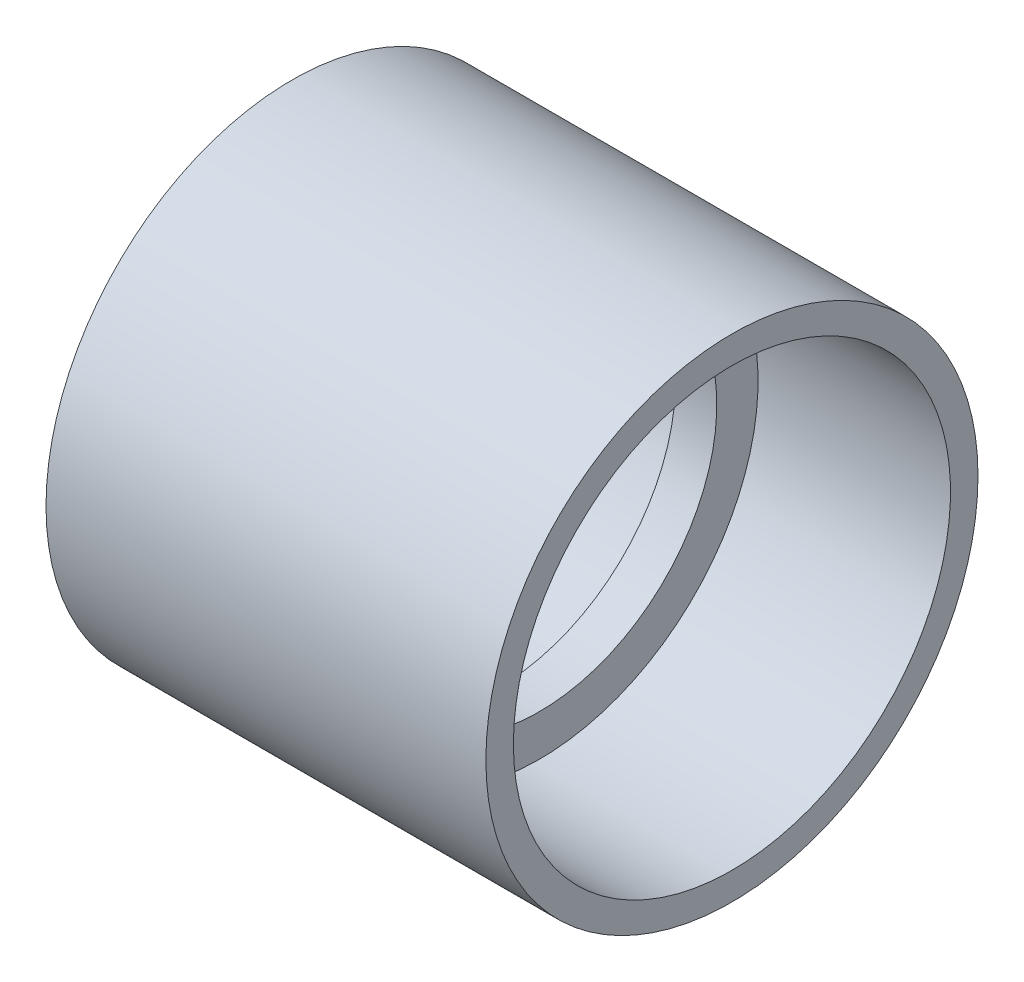
ISO-10303-21;
HEADER;
FILE_DESCRIPTION(('STEP AP214'),'2;1');
FILE_NAME('part.step','',(''),(''),'','','');
FILE_SCHEMA(('AUTOMOTIVE_DESIGN { 1 0 10303 214 1 1 1 1 }'));
ENDSEC;
DATA;
#1=APPLICATION_CONTEXT('core data for automotive mechanical design processes');
#2=APPLICATION_PROTOCOL_DEFINITION('international standard','automotive_design',2000,#1);
#3=PRODUCT_CONTEXT('',#1,'mechanical');
#4=PRODUCT('Part','Part','',(#3));
#5=PRODUCT_RELATED_PRODUCT_CATEGORY('part','',(#4));
#6=PRODUCT_DEFINITION_FORMATION('','',#4);
#7=PRODUCT_DEFINITION_CONTEXT('part definition',#1,'design');
#8=PRODUCT_DEFINITION('design','',#6,#7);
#9=PRODUCT_DEFINITION_SHAPE('','',#8);
#10=(LENGTH_UNIT() NAMED_UNIT(*) SI_UNIT(.MILLI.,.METRE.));
#11=(NAMED_UNIT(*) PLANE_ANGLE_UNIT() SI_UNIT($,.RADIAN.));
#12=(NAMED_UNIT(*) SI_UNIT($,.STERADIAN.) SOLID_ANGLE_UNIT());
#13=UNCERTAINTY_MEASURE_WITH_UNIT(LENGTH_MEASURE(1.E-05),#10,'distance_accuracy_value','');
#14=(GEOMETRIC_REPRESENTATION_CONTEXT(3) GLOBAL_UNCERTAINTY_ASSIGNED_CONTEXT((#13)) GLOBAL_UNIT_ASSIGNED_CONTEXT((#10,
#11,#12)) REPRESENTATION_CONTEXT('',''));
#15=CARTESIAN_POINT('',(0.,0.,0.));
#16=DIRECTION('',(0.,0.,1.));
#17=DIRECTION('',(1.,0.,0.));
#18=AXIS2_PLACEMENT_3D('',#15,#16,#17);
#19=CARTESIAN_POINT('',(-15.,0.,-15.9));
#20=DIRECTION('',(-1.,0.,0.));
#21=DIRECTION('',(0.,0.,0.999999999999999));
#22=AXIS2_PLACEMENT_3D('',#19,#20,#21);
#23=PLANE('',#22);
#24=CARTESIAN_POINT('',(-15.,0.,0.));
#25=DIRECTION('',(-1.,0.,0.));
#26=DIRECTION('',(0.,0.,0.999999999999999));
#27=AXIS2_PLACEMENT_3D('',#24,#25,#26);
#28=CIRCLE('',#27,17.9);
#29=CARTESIAN_POINT('',(-15.,0.,17.9));
#30=VERTEX_POINT('',#29);
#31=EDGE_CURVE('E12',#30,#30,#28,.T.);
#32=ORIENTED_EDGE('',*,*,#31,.T.);
#33=EDGE_LOOP('',(#32));
#34=FACE_BOUND('',#33,.T.);
#35=CARTESIAN_POINT('',(-15.,0.,0.));
#36=DIRECTION('',(-1.,0.,0.));
#37=DIRECTION('',(0.,0.,0.999999999999999));
#38=AXIS2_PLACEMENT_3D('',#35,#36,#37);
#39=CIRCLE('',#38,15.9);
#40=CARTESIAN_POINT('',(-15.,0.,15.9));
#41=VERTEX_POINT('',#40);
#42=EDGE_CURVE('E90',#41,#41,#39,.T.);
#43=ORIENTED_EDGE('',*,*,#42,.F.);
#44=EDGE_LOOP('',(#43));
#45=FACE_BOUND('',#44,.T.);
#46=ADVANCED_FACE('F51',(#34,#45),#23,.T.);
#47=CARTESIAN_POINT('',(-15.,0.,0.));
#48=DIRECTION('',(-1.,0.,0.));
#49=DIRECTION('',(0.,0.,0.999999999999999));
#50=AXIS2_PLACEMENT_3D('',#47,#48,#49);
#51=CYLINDRICAL_SURFACE('',#50,17.9);
#52=CARTESIAN_POINT('',(17.,0.,0.));
#53=DIRECTION('',(-1.,0.,0.));
#54=DIRECTION('',(0.,0.,0.999999999999999));
#55=AXIS2_PLACEMENT_3D('',#52,#53,#54);
#56=CIRCLE('',#55,17.9);
#57=CARTESIAN_POINT('',(17.,0.,17.9));
#58=VERTEX_POINT('',#57);
#59=EDGE_CURVE('E58',#58,#58,#56,.T.);
#60=ORIENTED_EDGE('',*,*,#59,.T.);
#61=EDGE_LOOP('',(#60));
#62=FACE_BOUND('',#61,.T.);
#63=ORIENTED_EDGE('',*,*,#31,.F.);
#64=EDGE_LOOP('',(#63));
#65=FACE_BOUND('',#64,.T.);
#66=ADVANCED_FACE('F100',(#62,#65),#51,.T.);
#67=CARTESIAN_POINT('',(17.,0.,-15.9));
#68=DIRECTION('',(-1.,0.,0.));
#69=DIRECTION('',(0.,0.,0.999999999999999));
#70=AXIS2_PLACEMENT_3D('',#67,#68,#69);
#71=PLANE('',#70);
#72=ORIENTED_EDGE('',*,*,#59,.F.);
#73=EDGE_LOOP('',(#72));
#74=FACE_BOUND('',#73,.T.);
#75=CARTESIAN_POINT('',(17.,0.,0.));
#76=DIRECTION('',(-1.,0.,0.));
#77=DIRECTION('',(0.,0.,0.999999999999999));
#78=AXIS2_PLACEMENT_3D('',#75,#76,#77);
#79=CIRCLE('',#78,15.9);
#80=CARTESIAN_POINT('',(17.,0.,15.9));
#81=VERTEX_POINT('',#80);
#82=EDGE_CURVE('E65',#81,#81,#79,.T.);
#83=ORIENTED_EDGE('',*,*,#82,.T.);
#84=EDGE_LOOP('',(#83));
#85=FACE_BOUND('',#84,.T.);
#86=ADVANCED_FACE('F104',(#74,#85),#71,.F.);
#87=CARTESIAN_POINT('',(-15.,0.,0.));
#88=DIRECTION('',(-1.,0.,0.));
#89=DIRECTION('',(0.,0.,0.999999999999999));
#90=AXIS2_PLACEMENT_3D('',#87,#88,#89);
#91=CYLINDRICAL_SURFACE('',#90,15.9);
#92=ORIENTED_EDGE('',*,*,#82,.F.);
#93=EDGE_LOOP('',(#92));
#94=FACE_BOUND('',#93,.T.);
#95=CARTESIAN_POINT('',(3.,0.,0.));
#96=DIRECTION('',(-1.,0.,0.));
#97=DIRECTION('',(0.,0.,0.999999999999999));
#98=AXIS2_PLACEMENT_3D('',#95,#96,#97);
#99=CIRCLE('',#98,15.9);
#100=CARTESIAN_POINT('',(3.,0.,15.9));
#101=VERTEX_POINT('',#100);
#102=EDGE_CURVE('E72',#101,#101,#99,.T.);
#103=ORIENTED_EDGE('',*,*,#102,.T.);
#104=EDGE_LOOP('',(#103));
#105=FACE_BOUND('',#104,.T.);
#106=ADVANCED_FACE('F108',(#94,#105),#91,.F.);
#107=CARTESIAN_POINT('',(3.,0.,-12.9));
#108=DIRECTION('',(-1.,0.,0.));
#109=DIRECTION('',(0.,0.,0.999999999999999));
#110=AXIS2_PLACEMENT_3D('',#107,#108,#109);
#111=PLANE('',#110);
#112=ORIENTED_EDGE('',*,*,#102,.F.);
#113=EDGE_LOOP('',(#112));
#114=FACE_BOUND('',#113,.T.);
#115=CARTESIAN_POINT('',(3.,0.,0.));
#116=DIRECTION('',(-1.,0.,0.));
#117=DIRECTION('',(0.,0.,0.999999999999999));
#118=AXIS2_PLACEMENT_3D('',#115,#116,#117);
#119=CIRCLE('',#118,12.9);
#120=CARTESIAN_POINT('',(3.,0.,12.9));
#121=VERTEX_POINT('',#120);
#122=EDGE_CURVE('E78',#121,#121,#119,.T.);
#123=ORIENTED_EDGE('',*,*,#122,.T.);
#124=EDGE_LOOP('',(#123));
#125=FACE_BOUND('',#124,.T.);
#126=ADVANCED_FACE('F115',(#114,#125),#111,.F.);
#127=CARTESIAN_POINT('',(-15.,0.,0.));
#128=DIRECTION('',(-1.,0.,0.));
#129=DIRECTION('',(0.,0.,0.999999999999999));
#130=AXIS2_PLACEMENT_3D('',#127,#128,#129);
#131=CYLINDRICAL_SURFACE('',#130,12.9);
#132=ORIENTED_EDGE('',*,*,#122,.F.);
#133=EDGE_LOOP('',(#132));
#134=FACE_BOUND('',#133,.T.);
#135=CARTESIAN_POINT('',(0.,0.,0.));
#136=DIRECTION('',(-1.,0.,0.));
#137=DIRECTION('',(0.,0.,0.999999999999999));
#138=AXIS2_PLACEMENT_3D('',#135,#136,#137);
#139=CIRCLE('',#138,12.9);
#140=CARTESIAN_POINT('',(0.,0.,12.9));
#141=VERTEX_POINT('',#140);
#142=EDGE_CURVE('E82',#141,#141,#139,.T.);
#143=ORIENTED_EDGE('',*,*,#142,.T.);
#144=EDGE_LOOP('',(#143));
#145=FACE_BOUND('',#144,.T.);
#146=ADVANCED_FACE('F119',(#134,#145),#131,.F.);
#147=CARTESIAN_POINT('',(0.,0.,-12.9));
#148=DIRECTION('',(-1.,0.,0.));
#149=DIRECTION('',(0.,0.,0.999999999999999));
#150=AXIS2_PLACEMENT_3D('',#147,#148,#149);
#151=PLANE('',#150);
#152=CARTESIAN_POINT('',(0.,0.,0.));
#153=DIRECTION('',(-1.,0.,0.));
#154=DIRECTION('',(0.,0.,0.999999999999999));
#155=AXIS2_PLACEMENT_3D('',#152,#153,#154);
#156=CIRCLE('',#155,15.9);
#157=CARTESIAN_POINT('',(0.,0.,15.9));
#158=VERTEX_POINT('',#157);
#159=EDGE_CURVE('E86',#158,#158,#156,.T.);
#160=ORIENTED_EDGE('',*,*,#159,.T.);
#161=EDGE_LOOP('',(#160));
#162=FACE_BOUND('',#161,.T.);
#163=ORIENTED_EDGE('',*,*,#142,.F.);
#164=EDGE_LOOP('',(#163));
#165=FACE_BOUND('',#164,.T.);
#166=ADVANCED_FACE('F123',(#162,#165),#151,.T.);
#167=CARTESIAN_POINT('',(-15.,0.,0.));
#168=DIRECTION('',(-1.,0.,0.));
#169=DIRECTION('',(0.,0.,0.999999999999999));
#170=AXIS2_PLACEMENT_3D('',#167,#168,#169);
#171=CYLINDRICAL_SURFACE('',#170,15.9);
#172=ORIENTED_EDGE('',*,*,#159,.F.);
#173=EDGE_LOOP('',(#172));
#174=FACE_BOUND('',#173,.T.);
#175=ORIENTED_EDGE('',*,*,#42,.T.);
#176=EDGE_LOOP('',(#175));
#177=FACE_BOUND('',#176,.T.);
#178=ADVANCED_FACE('F97',(#174,#177),#171,.F.);
#179=CLOSED_SHELL('',(#46,#66,#86,#106,#126,#146,#166,#178));
#180=MANIFOLD_SOLID_BREP('B2',#179);
#181=ADVANCED_BREP_SHAPE_REPRESENTATION('',(#18,#180),#14);
#182=SHAPE_DEFINITION_REPRESENTATION(#9,#181);
ENDSEC;
END-ISO-10303-21;
